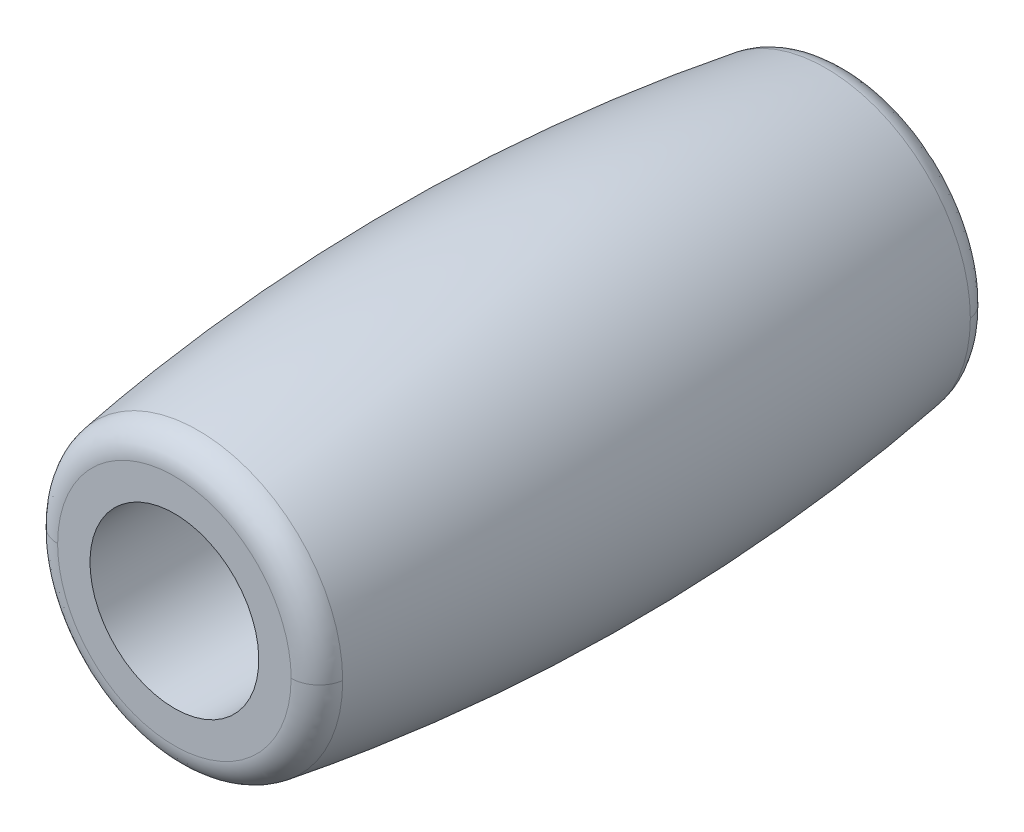
ISO-10303-21;
HEADER;
FILE_DESCRIPTION(('STEP AP214'),'2;1');
FILE_NAME('part.step','',(''),(''),'','','');
FILE_SCHEMA(('AUTOMOTIVE_DESIGN { 1 0 10303 214 1 1 1 1 }'));
ENDSEC;
DATA;
#1=APPLICATION_CONTEXT('core data for automotive mechanical design processes');
#2=APPLICATION_PROTOCOL_DEFINITION('international standard','automotive_design',2000,#1);
#3=PRODUCT_CONTEXT('',#1,'mechanical');
#4=PRODUCT('Part','Part','',(#3));
#5=PRODUCT_RELATED_PRODUCT_CATEGORY('part','',(#4));
#6=PRODUCT_DEFINITION_FORMATION('','',#4);
#7=PRODUCT_DEFINITION_CONTEXT('part definition',#1,'design');
#8=PRODUCT_DEFINITION('design','',#6,#7);
#9=PRODUCT_DEFINITION_SHAPE('','',#8);
#10=(LENGTH_UNIT() NAMED_UNIT(*) SI_UNIT(.MILLI.,.METRE.));
#11=(NAMED_UNIT(*) PLANE_ANGLE_UNIT() SI_UNIT($,.RADIAN.));
#12=(NAMED_UNIT(*) SI_UNIT($,.STERADIAN.) SOLID_ANGLE_UNIT());
#13=UNCERTAINTY_MEASURE_WITH_UNIT(LENGTH_MEASURE(1.E-05),#10,'distance_accuracy_value','');
#14=(GEOMETRIC_REPRESENTATION_CONTEXT(3) GLOBAL_UNCERTAINTY_ASSIGNED_CONTEXT((#13)) GLOBAL_UNIT_ASSIGNED_CONTEXT((#10,
#11,#12)) REPRESENTATION_CONTEXT('',''));
#15=CARTESIAN_POINT('',(0.,0.,0.));
#16=DIRECTION('',(0.,0.,1.));
#17=DIRECTION('',(1.,0.,0.));
#18=AXIS2_PLACEMENT_3D('',#15,#16,#17);
#19=CARTESIAN_POINT('',(0.,0.,-38.1));
#20=DIRECTION('',(0.,0.,1.));
#21=DIRECTION('',(0.,-1.,0.));
#22=AXIS2_PLACEMENT_3D('',#19,#20,#21);
#23=CYLINDRICAL_SURFACE('',#22,4.7625);
#24=CARTESIAN_POINT('',(0.,0.,-38.1));
#25=DIRECTION('',(0.,0.,1.));
#26=DIRECTION('',(0.,-1.,0.));
#27=AXIS2_PLACEMENT_3D('',#24,#25,#26);
#28=CIRCLE('',#27,4.7625);
#29=CARTESIAN_POINT('',(0.,-4.7625,-38.1));
#30=VERTEX_POINT('',#29);
#31=EDGE_CURVE('E20',#30,#30,#28,.T.);
#32=ORIENTED_EDGE('',*,*,#31,.F.);
#33=EDGE_LOOP('',(#32));
#34=FACE_BOUND('',#33,.T.);
#35=CARTESIAN_POINT('',(0.,0.,0.));
#36=DIRECTION('',(0.,0.,1.));
#37=DIRECTION('',(0.,-1.,0.));
#38=AXIS2_PLACEMENT_3D('',#35,#36,#37);
#39=CIRCLE('',#38,4.7625);
#40=CARTESIAN_POINT('',(0.,-4.76250000000003,0.));
#41=VERTEX_POINT('',#40);
#42=EDGE_CURVE('E66',#41,#41,#39,.F.);
#43=ORIENTED_EDGE('',*,*,#42,.F.);
#44=EDGE_LOOP('',(#43));
#45=FACE_BOUND('',#44,.T.);
#46=ADVANCED_FACE('F16',(#34,#45),#23,.F.);
#47=CARTESIAN_POINT('',(6.665221196,-6.665245795,-38.1));
#48=DIRECTION('',(0.,0.,-1.));
#49=DIRECTION('',(-1.,0.,0.));
#50=AXIS2_PLACEMENT_3D('',#47,#48,#49);
#51=PLANE('',#50);
#52=ORIENTED_EDGE('',*,*,#31,.T.);
#53=EDGE_LOOP('',(#52));
#54=FACE_BOUND('',#53,.T.);
#55=CARTESIAN_POINT('',(6.586186952,0.,-38.1));
#56=CARTESIAN_POINT('',(6.586186952,13.172373905,-38.1));
#57=CARTESIAN_POINT('',(-6.586186952,13.172373905,-38.1));
#58=CARTESIAN_POINT('',(-6.586186952,0.,-38.1));
#59=(BOUNDED_CURVE() B_SPLINE_CURVE(3,(#55,#56,#57,#58),.UNSPECIFIED.,.F.,
.F.) B_SPLINE_CURVE_WITH_KNOTS((4,4),(0.,1.),
.UNSPECIFIED.) CURVE() GEOMETRIC_REPRESENTATION_ITEM() RATIONAL_B_SPLINE_CURVE((1.,
0.333333333333333,0.333333333333333,1.)) REPRESENTATION_ITEM(''));
#60=CARTESIAN_POINT('',(6.58618695092097,0.,-38.1));
#61=VERTEX_POINT('',#60);
#62=CARTESIAN_POINT('',(-6.58618695092097,0.,-38.1));
#63=VERTEX_POINT('',#62);
#64=EDGE_CURVE('E58',#61,#63,#59,.T.);
#65=ORIENTED_EDGE('',*,*,#64,.F.);
#66=CARTESIAN_POINT('',(-6.586186952,0.,-38.1));
#67=CARTESIAN_POINT('',(-6.586186952,-13.172373905,-38.1));
#68=CARTESIAN_POINT('',(6.586186952,-13.172373905,-38.1));
#69=CARTESIAN_POINT('',(6.586186952,0.,-38.1));
#70=(BOUNDED_CURVE() B_SPLINE_CURVE(3,(#66,#67,#68,#69),.UNSPECIFIED.,.F.,
.F.) B_SPLINE_CURVE_WITH_KNOTS((4,4),(0.,1.),
.UNSPECIFIED.) CURVE() GEOMETRIC_REPRESENTATION_ITEM() RATIONAL_B_SPLINE_CURVE((1.,
0.333333333333333,0.333333333333333,1.)) REPRESENTATION_ITEM(''));
#71=EDGE_CURVE('E55',#63,#61,#70,.T.);
#72=ORIENTED_EDGE('',*,*,#71,.F.);
#73=EDGE_LOOP('',(#65,#72));
#74=FACE_BOUND('',#73,.T.);
#75=ADVANCED_FACE('F61',(#54,#74),#51,.T.);
#76=CARTESIAN_POINT('',(-6.665221196,-6.665245795,0.));
#77=DIRECTION('',(0.,0.,1.));
#78=DIRECTION('',(1.,0.,0.));
#79=AXIS2_PLACEMENT_3D('',#76,#77,#78);
#80=PLANE('',#79);
#81=ORIENTED_EDGE('',*,*,#42,.T.);
#82=EDGE_LOOP('',(#81));
#83=FACE_BOUND('',#82,.T.);
#84=CARTESIAN_POINT('',(-6.586186952,0.,0.));
#85=CARTESIAN_POINT('',(-6.586186952,13.172373905,0.));
#86=CARTESIAN_POINT('',(6.586186952,13.172373905,0.));
#87=CARTESIAN_POINT('',(6.586186952,0.,0.));
#88=(BOUNDED_CURVE() B_SPLINE_CURVE(3,(#84,#85,#86,#87),.UNSPECIFIED.,.F.,
.F.) B_SPLINE_CURVE_WITH_KNOTS((4,4),(0.,1.),
.UNSPECIFIED.) CURVE() GEOMETRIC_REPRESENTATION_ITEM() RATIONAL_B_SPLINE_CURVE((1.,
0.333333333333333,0.333333333333333,1.)) REPRESENTATION_ITEM(''));
#89=CARTESIAN_POINT('',(-6.58618695092097,0.,0.));
#90=VERTEX_POINT('',#89);
#91=CARTESIAN_POINT('',(6.58618695092097,0.,0.));
#92=VERTEX_POINT('',#91);
#93=EDGE_CURVE('E65',#90,#92,#88,.T.);
#94=ORIENTED_EDGE('',*,*,#93,.F.);
#95=CARTESIAN_POINT('',(6.586186952,0.,0.));
#96=CARTESIAN_POINT('',(6.586186952,-13.172373905,0.));
#97=CARTESIAN_POINT('',(-6.586186952,-13.172373905,0.));
#98=CARTESIAN_POINT('',(-6.586186952,0.,0.));
#99=(BOUNDED_CURVE() B_SPLINE_CURVE(3,(#95,#96,#97,#98),.UNSPECIFIED.,.F.,
.F.) B_SPLINE_CURVE_WITH_KNOTS((4,4),(0.,1.),
.UNSPECIFIED.) CURVE() GEOMETRIC_REPRESENTATION_ITEM() RATIONAL_B_SPLINE_CURVE((1.,
0.333333333333333,0.333333333333333,1.)) REPRESENTATION_ITEM(''));
#100=EDGE_CURVE('E165',#92,#90,#99,.T.);
#101=ORIENTED_EDGE('',*,*,#100,.F.);
#102=EDGE_LOOP('',(#94,#101));
#103=FACE_BOUND('',#102,.T.);
#104=ADVANCED_FACE('F211',(#83,#103),#80,.T.);
#105=CARTESIAN_POINT('',(-6.586186952,0.,-38.1));
#106=CARTESIAN_POINT('',(-6.586186952,13.172373905,-38.1));
#107=CARTESIAN_POINT('',(6.586186952,13.172373905,-38.1));
#108=CARTESIAN_POINT('',(6.586186952,0.,-38.1));
#109=CARTESIAN_POINT('',(-7.405984151,0.,-38.1));
#110=CARTESIAN_POINT('',(-7.405984151,14.811968302,-38.1));
#111=CARTESIAN_POINT('',(7.405984151,14.811968302,-38.1));
#112=CARTESIAN_POINT('',(7.405984151,0.,-38.1));
#113=CARTESIAN_POINT('',(-8.028664823,0.,-37.56676813));
#114=CARTESIAN_POINT('',(-8.028664823,16.057329647,-37.56676813));
#115=CARTESIAN_POINT('',(8.028664823,16.057329647,-37.56676813));
#116=CARTESIAN_POINT('',(8.028664823,0.,-37.56676813));
#117=CARTESIAN_POINT('',(-8.154787469,0.,-36.756730769));
#118=CARTESIAN_POINT('',(-8.154787469,16.309574939,-36.756730769));
#119=CARTESIAN_POINT('',(8.154787469,16.309574939,-36.756730769));
#120=CARTESIAN_POINT('',(8.154787469,0.,-36.756730769));
#121=(BOUNDED_SURFACE() B_SPLINE_SURFACE(3,3,((#105,#106,#107,#108),(#109,#110,#111,#112),(#113,
#114,#115,#116),(#117,#118,#119,#120)),.UNSPECIFIED.,.F.,.F.,
.F.) B_SPLINE_SURFACE_WITH_KNOTS((4,4),(4,4),(0.,1.),(0.,1.),
.UNSPECIFIED.) GEOMETRIC_REPRESENTATION_ITEM() RATIONAL_B_SPLINE_SURFACE(((1.,0.333333333333333,
0.333333333333333,1.),(0.839703016875172,0.279901005625058,0.279901005625058,0.839703016875172),
(0.839703016875172,0.279901005625058,0.279901005625058,0.839703016875172),(1.,0.333333333333333,
0.333333333333333,1.))) REPRESENTATION_ITEM('') SURFACE());
#122=CARTESIAN_POINT('',(-6.586186952,0.,-38.1));
#123=CARTESIAN_POINT('',(-7.405984151,0.,-38.1));
#124=CARTESIAN_POINT('',(-8.028664823,0.,-37.56676813));
#125=CARTESIAN_POINT('',(-8.154787469,0.,-36.756730769));
#126=(BOUNDED_CURVE() B_SPLINE_CURVE(3,(#122,#123,#124,#125),.UNSPECIFIED.,.F.,
.F.) B_SPLINE_CURVE_WITH_KNOTS((4,4),(0.,1.),
.UNSPECIFIED.) CURVE() GEOMETRIC_REPRESENTATION_ITEM() RATIONAL_B_SPLINE_CURVE((1.,
0.839703016875172,0.839703016875172,1.)) REPRESENTATION_ITEM(''));
#127=CARTESIAN_POINT('',(-8.154787469,0.,-36.756730769));
#128=VERTEX_POINT('',#127);
#129=EDGE_CURVE('E77',#128,#63,#126,.F.);
#130=CARTESIAN_POINT('',(0.,0.,-36.756730769));
#131=DIRECTION('',(0.,0.,1.));
#132=DIRECTION('',(1.,0.,0.));
#133=AXIS2_PLACEMENT_3D('',#130,#131,#132);
#134=CIRCLE('',#133,8.154787469);
#135=CARTESIAN_POINT('',(8.154787469,0.,-36.756730769));
#136=VERTEX_POINT('',#135);
#137=EDGE_CURVE('E73',#136,#128,#134,.T.);
#138=CARTESIAN_POINT('',(6.586186952,0.,-38.1));
#139=CARTESIAN_POINT('',(7.405984151,0.,-38.1));
#140=CARTESIAN_POINT('',(8.028664823,0.,-37.56676813));
#141=CARTESIAN_POINT('',(8.154787469,0.,-36.756730769));
#142=(BOUNDED_CURVE() B_SPLINE_CURVE(3,(#138,#139,#140,#141),.UNSPECIFIED.,.F.,
.F.) B_SPLINE_CURVE_WITH_KNOTS((4,4),(0.,1.),
.UNSPECIFIED.) CURVE() GEOMETRIC_REPRESENTATION_ITEM() RATIONAL_B_SPLINE_CURVE((1.,
0.839703016875172,0.839703016875172,1.)) REPRESENTATION_ITEM(''));
#143=EDGE_CURVE('E70',#61,#136,#142,.T.);
#144=ORIENTED_EDGE('',*,*,#129,.F.);
#145=ORIENTED_EDGE('',*,*,#137,.F.);
#146=ORIENTED_EDGE('',*,*,#143,.F.);
#147=ORIENTED_EDGE('',*,*,#64,.T.);
#148=EDGE_LOOP('',(#144,#145,#146,#147));
#149=FACE_BOUND('',#148,.T.);
#150=ADVANCED_FACE('F71',(#149),#121,.T.);
#151=CARTESIAN_POINT('',(6.586186952,0.,0.));
#152=CARTESIAN_POINT('',(6.586186952,13.172373905,0.));
#153=CARTESIAN_POINT('',(-6.586186952,13.172373905,0.));
#154=CARTESIAN_POINT('',(-6.586186952,0.,0.));
#155=CARTESIAN_POINT('',(7.405984151,0.,0.));
#156=CARTESIAN_POINT('',(7.405984151,14.811968302,0.));
#157=CARTESIAN_POINT('',(-7.405984151,14.811968302,0.));
#158=CARTESIAN_POINT('',(-7.405984151,0.,0.));
#159=CARTESIAN_POINT('',(8.028664823,0.,-0.53323187));
#160=CARTESIAN_POINT('',(8.028664823,16.057329647,-0.53323187));
#161=CARTESIAN_POINT('',(-8.028664823,16.057329647,-0.53323187));
#162=CARTESIAN_POINT('',(-8.028664823,0.,-0.53323187));
#163=CARTESIAN_POINT('',(8.154787469,0.,-1.343269231));
#164=CARTESIAN_POINT('',(8.154787469,16.309574939,-1.343269231));
#165=CARTESIAN_POINT('',(-8.154787469,16.309574939,-1.343269231));
#166=CARTESIAN_POINT('',(-8.154787469,0.,-1.343269231));
#167=(BOUNDED_SURFACE() B_SPLINE_SURFACE(3,3,((#151,#152,#153,#154),(#155,#156,#157,#158),(#159,
#160,#161,#162),(#163,#164,#165,#166)),.UNSPECIFIED.,.F.,.F.,
.F.) B_SPLINE_SURFACE_WITH_KNOTS((4,4),(4,4),(0.,1.),(0.,1.),
.UNSPECIFIED.) GEOMETRIC_REPRESENTATION_ITEM() RATIONAL_B_SPLINE_SURFACE(((1.,0.333333333333333,
0.333333333333333,1.),(0.839703016875165,0.279901005625055,0.279901005625055,0.839703016875165),
(0.839703016875165,0.279901005625055,0.279901005625055,0.839703016875165),(1.,0.333333333333333,
0.333333333333333,1.))) REPRESENTATION_ITEM('') SURFACE());
#168=CARTESIAN_POINT('',(6.586186952,0.,0.));
#169=CARTESIAN_POINT('',(7.405984151,0.,0.));
#170=CARTESIAN_POINT('',(8.028664823,0.,-0.53323187));
#171=CARTESIAN_POINT('',(8.154787469,0.,-1.343269231));
#172=(BOUNDED_CURVE() B_SPLINE_CURVE(3,(#168,#169,#170,#171),.UNSPECIFIED.,.F.,
.F.) B_SPLINE_CURVE_WITH_KNOTS((4,4),(0.,1.),
.UNSPECIFIED.) CURVE() GEOMETRIC_REPRESENTATION_ITEM() RATIONAL_B_SPLINE_CURVE((1.,
0.839703016875165,0.839703016875165,1.)) REPRESENTATION_ITEM(''));
#173=CARTESIAN_POINT('',(8.154787469,0.,-1.343269231));
#174=VERTEX_POINT('',#173);
#175=EDGE_CURVE('E158',#174,#92,#172,.F.);
#176=CARTESIAN_POINT('',(0.,0.,-1.343269231));
#177=DIRECTION('',(0.,0.,-1.));
#178=DIRECTION('',(-1.,0.,0.));
#179=AXIS2_PLACEMENT_3D('',#176,#177,#178);
#180=CIRCLE('',#179,8.154787469);
#181=CARTESIAN_POINT('',(-8.154787469,0.,-1.343269231));
#182=VERTEX_POINT('',#181);
#183=EDGE_CURVE('E35',#182,#174,#180,.T.);
#184=CARTESIAN_POINT('',(-6.586186952,0.,0.));
#185=CARTESIAN_POINT('',(-7.405984151,0.,0.));
#186=CARTESIAN_POINT('',(-8.028664823,0.,-0.53323187));
#187=CARTESIAN_POINT('',(-8.154787469,0.,-1.343269231));
#188=(BOUNDED_CURVE() B_SPLINE_CURVE(3,(#184,#185,#186,#187),.UNSPECIFIED.,.F.,
.F.) B_SPLINE_CURVE_WITH_KNOTS((4,4),(0.,1.),
.UNSPECIFIED.) CURVE() GEOMETRIC_REPRESENTATION_ITEM() RATIONAL_B_SPLINE_CURVE((1.,
0.839703016875165,0.839703016875165,1.)) REPRESENTATION_ITEM(''));
#189=EDGE_CURVE('E159',#90,#182,#188,.T.);
#190=ORIENTED_EDGE('',*,*,#175,.F.);
#191=ORIENTED_EDGE('',*,*,#183,.F.);
#192=ORIENTED_EDGE('',*,*,#189,.F.);
#193=ORIENTED_EDGE('',*,*,#93,.T.);
#194=EDGE_LOOP('',(#190,#191,#192,#193));
#195=FACE_BOUND('',#194,.T.);
#196=ADVANCED_FACE('F104',(#195),#167,.T.);
#197=CARTESIAN_POINT('',(6.586186952,0.,-38.1));
#198=CARTESIAN_POINT('',(6.586186952,-13.172373905,-38.1));
#199=CARTESIAN_POINT('',(-6.586186952,-13.172373905,-38.1));
#200=CARTESIAN_POINT('',(-6.586186952,0.,-38.1));
#201=CARTESIAN_POINT('',(7.405984151,0.,-38.1));
#202=CARTESIAN_POINT('',(7.405984151,-14.811968302,-38.1));
#203=CARTESIAN_POINT('',(-7.405984151,-14.811968302,-38.1));
#204=CARTESIAN_POINT('',(-7.405984151,0.,-38.1));
#205=CARTESIAN_POINT('',(8.028664823,0.,-37.56676813));
#206=CARTESIAN_POINT('',(8.028664823,-16.057329647,-37.56676813));
#207=CARTESIAN_POINT('',(-8.028664823,-16.057329647,-37.56676813));
#208=CARTESIAN_POINT('',(-8.028664823,0.,-37.56676813));
#209=CARTESIAN_POINT('',(8.154787469,0.,-36.756730769));
#210=CARTESIAN_POINT('',(8.154787469,-16.309574939,-36.756730769));
#211=CARTESIAN_POINT('',(-8.154787469,-16.309574939,-36.756730769));
#212=CARTESIAN_POINT('',(-8.154787469,0.,-36.756730769));
#213=(BOUNDED_SURFACE() B_SPLINE_SURFACE(3,3,((#197,#198,#199,#200),(#201,#202,#203,#204),(#205,
#206,#207,#208),(#209,#210,#211,#212)),.UNSPECIFIED.,.F.,.F.,
.F.) B_SPLINE_SURFACE_WITH_KNOTS((4,4),(4,4),(0.,1.),(0.,1.),
.UNSPECIFIED.) GEOMETRIC_REPRESENTATION_ITEM() RATIONAL_B_SPLINE_SURFACE(((1.,0.333333333333333,
0.333333333333333,1.),(0.839703016875172,0.279901005625058,0.279901005625058,0.839703016875172),
(0.839703016875172,0.279901005625058,0.279901005625058,0.839703016875172),(1.,0.333333333333333,
0.333333333333333,1.))) REPRESENTATION_ITEM('') SURFACE());
#214=CARTESIAN_POINT('',(0.,0.,-36.756730769));
#215=DIRECTION('',(0.,0.,1.));
#216=DIRECTION('',(1.,0.,0.));
#217=AXIS2_PLACEMENT_3D('',#214,#215,#216);
#218=CIRCLE('',#217,8.154787469);
#219=EDGE_CURVE('E26',#128,#136,#218,.T.);
#220=ORIENTED_EDGE('',*,*,#219,.F.);
#221=ORIENTED_EDGE('',*,*,#129,.T.);
#222=ORIENTED_EDGE('',*,*,#71,.T.);
#223=ORIENTED_EDGE('',*,*,#143,.T.);
#224=EDGE_LOOP('',(#220,#221,#222,#223));
#225=FACE_BOUND('',#224,.T.);
#226=ADVANCED_FACE('F80',(#225),#213,.T.);
#227=CARTESIAN_POINT('',(-6.586186952,0.,0.));
#228=CARTESIAN_POINT('',(-6.586186952,-13.172373905,0.));
#229=CARTESIAN_POINT('',(6.586186952,-13.172373905,0.));
#230=CARTESIAN_POINT('',(6.586186952,0.,0.));
#231=CARTESIAN_POINT('',(-7.405984151,0.,0.));
#232=CARTESIAN_POINT('',(-7.405984151,-14.811968302,0.));
#233=CARTESIAN_POINT('',(7.405984151,-14.811968302,0.));
#234=CARTESIAN_POINT('',(7.405984151,0.,0.));
#235=CARTESIAN_POINT('',(-8.028664823,0.,-0.53323187));
#236=CARTESIAN_POINT('',(-8.028664823,-16.057329647,-0.53323187));
#237=CARTESIAN_POINT('',(8.028664823,-16.057329647,-0.53323187));
#238=CARTESIAN_POINT('',(8.028664823,0.,-0.53323187));
#239=CARTESIAN_POINT('',(-8.154787469,0.,-1.343269231));
#240=CARTESIAN_POINT('',(-8.154787469,-16.309574939,-1.343269231));
#241=CARTESIAN_POINT('',(8.154787469,-16.309574939,-1.343269231));
#242=CARTESIAN_POINT('',(8.154787469,0.,-1.343269231));
#243=(BOUNDED_SURFACE() B_SPLINE_SURFACE(3,3,((#227,#228,#229,#230),(#231,#232,#233,#234),(#235,
#236,#237,#238),(#239,#240,#241,#242)),.UNSPECIFIED.,.F.,.F.,
.F.) B_SPLINE_SURFACE_WITH_KNOTS((4,4),(4,4),(0.,1.),(0.,1.),
.UNSPECIFIED.) GEOMETRIC_REPRESENTATION_ITEM() RATIONAL_B_SPLINE_SURFACE(((1.,0.333333333333333,
0.333333333333333,1.),(0.839703016875165,0.279901005625055,0.279901005625055,0.839703016875165),
(0.839703016875165,0.279901005625055,0.279901005625055,0.839703016875165),(1.,0.333333333333333,
0.333333333333333,1.))) REPRESENTATION_ITEM('') SURFACE());
#244=CARTESIAN_POINT('',(0.,0.,-1.343269231));
#245=DIRECTION('',(0.,0.,-1.));
#246=DIRECTION('',(-1.,0.,0.));
#247=AXIS2_PLACEMENT_3D('',#244,#245,#246);
#248=CIRCLE('',#247,8.154787469);
#249=EDGE_CURVE('E11',#174,#182,#248,.T.);
#250=ORIENTED_EDGE('',*,*,#249,.F.);
#251=ORIENTED_EDGE('',*,*,#175,.T.);
#252=ORIENTED_EDGE('',*,*,#100,.T.);
#253=ORIENTED_EDGE('',*,*,#189,.T.);
#254=EDGE_LOOP('',(#250,#251,#252,#253));
#255=FACE_BOUND('',#254,.T.);
#256=ADVANCED_FACE('F103',(#255),#243,.T.);
#257=CARTESIAN_POINT('',(0.,0.,-19.05));
#258=DIRECTION('',(0.,0.,-1.));
#259=DIRECTION('',(-1.,0.,0.));
#260=AXIS2_PLACEMENT_3D('',#257,#258,#259);
#261=DEGENERATE_TOROIDAL_SURFACE('',#260,105.568749954618,115.093749954838,.F.);
#262=ORIENTED_EDGE('',*,*,#183,.T.);
#263=ORIENTED_EDGE('',*,*,#249,.T.);
#264=EDGE_LOOP('',(#262,#263));
#265=FACE_BOUND('',#264,.T.);
#266=ORIENTED_EDGE('',*,*,#219,.T.);
#267=ORIENTED_EDGE('',*,*,#137,.T.);
#268=EDGE_LOOP('',(#266,#267));
#269=FACE_BOUND('',#268,.T.);
#270=ADVANCED_FACE('F18',(#265,#269),#261,.F.);
#271=CLOSED_SHELL('',(#46,#75,#104,#150,#196,#226,#256,#270));
#272=MANIFOLD_SOLID_BREP('B1',#271);
#273=ADVANCED_BREP_SHAPE_REPRESENTATION('',(#18,#272),#14);
#274=SHAPE_DEFINITION_REPRESENTATION(#9,#273);
ENDSEC;
END-ISO-10303-21;
